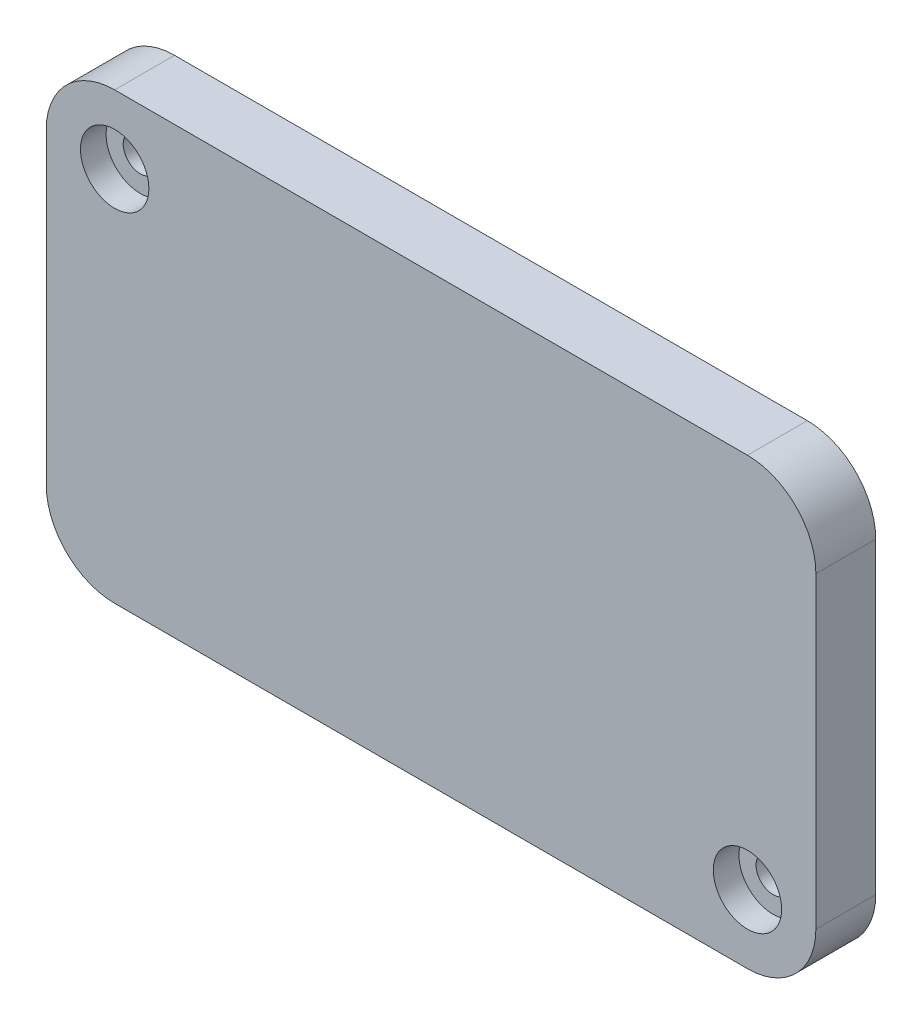
ISO-10303-21;
HEADER;
FILE_DESCRIPTION(('STEP AP214'),'2;1');
FILE_NAME('part.step','',(''),(''),'','','');
FILE_SCHEMA(('AUTOMOTIVE_DESIGN { 1 0 10303 214 1 1 1 1 }'));
ENDSEC;
DATA;
#1=APPLICATION_CONTEXT('core data for automotive mechanical design processes');
#2=APPLICATION_PROTOCOL_DEFINITION('international standard','automotive_design',2000,#1);
#3=PRODUCT_CONTEXT('',#1,'mechanical');
#4=PRODUCT('Part','Part','',(#3));
#5=PRODUCT_RELATED_PRODUCT_CATEGORY('part','',(#4));
#6=PRODUCT_DEFINITION_FORMATION('','',#4);
#7=PRODUCT_DEFINITION_CONTEXT('part definition',#1,'design');
#8=PRODUCT_DEFINITION('design','',#6,#7);
#9=PRODUCT_DEFINITION_SHAPE('','',#8);
#10=(LENGTH_UNIT() NAMED_UNIT(*) SI_UNIT(.MILLI.,.METRE.));
#11=(NAMED_UNIT(*) PLANE_ANGLE_UNIT() SI_UNIT($,.RADIAN.));
#12=(NAMED_UNIT(*) SI_UNIT($,.STERADIAN.) SOLID_ANGLE_UNIT());
#13=UNCERTAINTY_MEASURE_WITH_UNIT(LENGTH_MEASURE(1.E-05),#10,'distance_accuracy_value','');
#14=(GEOMETRIC_REPRESENTATION_CONTEXT(3) GLOBAL_UNCERTAINTY_ASSIGNED_CONTEXT((#13)) GLOBAL_UNIT_ASSIGNED_CONTEXT((#10,
#11,#12)) REPRESENTATION_CONTEXT('',''));
#15=CARTESIAN_POINT('',(0.,0.,0.));
#16=DIRECTION('',(0.,0.,1.));
#17=DIRECTION('',(1.,0.,0.));
#18=AXIS2_PLACEMENT_3D('',#15,#16,#17);
#19=CARTESIAN_POINT('',(0.,0.,3.5));
#20=DIRECTION('',(0.,0.,-1.));
#21=DIRECTION('',(-1.,0.,0.));
#22=AXIS2_PLACEMENT_3D('',#19,#20,#21);
#23=CYLINDRICAL_SURFACE('',#22,1.);
#24=CARTESIAN_POINT('',(0.,0.,0.));
#25=DIRECTION('',(0.,0.,1.));
#26=DIRECTION('',(1.,0.,0.));
#27=AXIS2_PLACEMENT_3D('',#24,#25,#26);
#28=CIRCLE('',#27,1.);
#29=CARTESIAN_POINT('',(1.,0.,0.));
#30=VERTEX_POINT('',#29);
#31=EDGE_CURVE('E130',#30,#30,#28,.T.);
#32=ORIENTED_EDGE('',*,*,#31,.F.);
#33=EDGE_LOOP('',(#32));
#34=FACE_BOUND('',#33,.T.);
#35=CARTESIAN_POINT('',(0.,0.,2.));
#36=DIRECTION('',(0.,0.,1.));
#37=DIRECTION('',(1.,0.,0.));
#38=AXIS2_PLACEMENT_3D('',#35,#36,#37);
#39=CIRCLE('',#38,1.);
#40=CARTESIAN_POINT('',(1.,0.,2.));
#41=VERTEX_POINT('',#40);
#42=EDGE_CURVE('E38',#41,#41,#39,.T.);
#43=ORIENTED_EDGE('',*,*,#42,.T.);
#44=EDGE_LOOP('',(#43));
#45=FACE_BOUND('',#44,.T.);
#46=ADVANCED_FACE('F34',(#34,#45),#23,.F.);
#47=CARTESIAN_POINT('',(37.,-18.,3.5));
#48=DIRECTION('',(0.,0.,-1.));
#49=DIRECTION('',(-1.,0.,0.));
#50=AXIS2_PLACEMENT_3D('',#47,#48,#49);
#51=CYLINDRICAL_SURFACE('',#50,0.999999999999998);
#52=CARTESIAN_POINT('',(37.,-18.,0.));
#53=DIRECTION('',(0.,0.,1.));
#54=DIRECTION('',(1.,0.,0.));
#55=AXIS2_PLACEMENT_3D('',#52,#53,#54);
#56=CIRCLE('',#55,0.999999999999998);
#57=CARTESIAN_POINT('',(38.,-18.,0.));
#58=VERTEX_POINT('',#57);
#59=EDGE_CURVE('E136',#58,#58,#56,.T.);
#60=ORIENTED_EDGE('',*,*,#59,.F.);
#61=EDGE_LOOP('',(#60));
#62=FACE_BOUND('',#61,.T.);
#63=CARTESIAN_POINT('',(37.,-18.,2.));
#64=DIRECTION('',(0.,0.,1.));
#65=DIRECTION('',(1.,0.,0.));
#66=AXIS2_PLACEMENT_3D('',#63,#64,#65);
#67=CIRCLE('',#66,0.999999999999998);
#68=CARTESIAN_POINT('',(38.,-18.,2.));
#69=VERTEX_POINT('',#68);
#70=EDGE_CURVE('E165',#69,#69,#67,.T.);
#71=ORIENTED_EDGE('',*,*,#70,.T.);
#72=EDGE_LOOP('',(#71));
#73=FACE_BOUND('',#72,.T.);
#74=ADVANCED_FACE('F219',(#62,#73),#51,.F.);
#75=CARTESIAN_POINT('',(0.,0.,3.5));
#76=DIRECTION('',(0.,0.,1.));
#77=DIRECTION('',(1.,0.,0.));
#78=AXIS2_PLACEMENT_3D('',#75,#76,#77);
#79=PLANE('',#78);
#80=CARTESIAN_POINT('',(37.,-18.,3.5));
#81=DIRECTION('',(0.,0.,1.));
#82=DIRECTION('',(1.,0.,0.));
#83=AXIS2_PLACEMENT_3D('',#80,#81,#82);
#84=CIRCLE('',#83,2.);
#85=CARTESIAN_POINT('',(39.,-18.,3.5));
#86=VERTEX_POINT('',#85);
#87=EDGE_CURVE('E172',#86,#86,#84,.T.);
#88=ORIENTED_EDGE('',*,*,#87,.F.);
#89=EDGE_LOOP('',(#88));
#90=FACE_BOUND('',#89,.T.);
#91=CARTESIAN_POINT('',(0.,0.,3.5));
#92=DIRECTION('',(0.,0.,1.));
#93=DIRECTION('',(1.,0.,0.));
#94=AXIS2_PLACEMENT_3D('',#91,#92,#93);
#95=CIRCLE('',#94,2.);
#96=CARTESIAN_POINT('',(2.,0.,3.5));
#97=VERTEX_POINT('',#96);
#98=EDGE_CURVE('E182',#97,#97,#95,.T.);
#99=ORIENTED_EDGE('',*,*,#98,.F.);
#100=EDGE_LOOP('',(#99));
#101=FACE_BOUND('',#100,.T.);
#102=DIRECTION('',(-1.,0.,0.));
#103=VECTOR('',#102,1.);
#104=CARTESIAN_POINT('',(-4.,4.,3.5));
#105=LINE('',#104,#103);
#106=CARTESIAN_POINT('',(37.,4.,3.5));
#107=VERTEX_POINT('',#106);
#108=CARTESIAN_POINT('',(0.,4.,3.5));
#109=VERTEX_POINT('',#108);
#110=EDGE_CURVE('E139',#107,#109,#105,.T.);
#111=ORIENTED_EDGE('',*,*,#110,.T.);
#112=CARTESIAN_POINT('',(0.,0.,3.5));
#113=DIRECTION('',(0.,0.,1.));
#114=DIRECTION('',(1.,0.,0.));
#115=AXIS2_PLACEMENT_3D('',#112,#113,#114);
#116=CIRCLE('',#115,4.);
#117=CARTESIAN_POINT('',(-4.,0.,3.5));
#118=VERTEX_POINT('',#117);
#119=EDGE_CURVE('E158',#109,#118,#116,.T.);
#120=ORIENTED_EDGE('',*,*,#119,.T.);
#121=DIRECTION('',(0.,-1.,0.));
#122=VECTOR('',#121,1.);
#123=CARTESIAN_POINT('',(-4.,4.,3.5));
#124=LINE('',#123,#122);
#125=CARTESIAN_POINT('',(-4.,-18.,3.5));
#126=VERTEX_POINT('',#125);
#127=EDGE_CURVE('E122',#118,#126,#124,.T.);
#128=ORIENTED_EDGE('',*,*,#127,.T.);
#129=CARTESIAN_POINT('',(0.,-18.,3.5));
#130=DIRECTION('',(0.,0.,1.));
#131=DIRECTION('',(1.,0.,0.));
#132=AXIS2_PLACEMENT_3D('',#129,#130,#131);
#133=CIRCLE('',#132,4.);
#134=CARTESIAN_POINT('',(0.,-22.,3.5));
#135=VERTEX_POINT('',#134);
#136=EDGE_CURVE('E156',#126,#135,#133,.T.);
#137=ORIENTED_EDGE('',*,*,#136,.T.);
#138=DIRECTION('',(1.,0.,0.));
#139=VECTOR('',#138,1.);
#140=CARTESIAN_POINT('',(-4.,-22.,3.5));
#141=LINE('',#140,#139);
#142=CARTESIAN_POINT('',(37.,-22.,3.5));
#143=VERTEX_POINT('',#142);
#144=EDGE_CURVE('E188',#135,#143,#141,.T.);
#145=ORIENTED_EDGE('',*,*,#144,.T.);
#146=CARTESIAN_POINT('',(37.,-18.,3.5));
#147=DIRECTION('',(0.,0.,1.));
#148=DIRECTION('',(1.,0.,0.));
#149=AXIS2_PLACEMENT_3D('',#146,#147,#148);
#150=CIRCLE('',#149,4.);
#151=CARTESIAN_POINT('',(41.,-18.,3.5));
#152=VERTEX_POINT('',#151);
#153=EDGE_CURVE('E57',#143,#152,#150,.T.);
#154=ORIENTED_EDGE('',*,*,#153,.T.);
#155=DIRECTION('',(0.,1.,0.));
#156=VECTOR('',#155,1.);
#157=CARTESIAN_POINT('',(41.,4.,3.5));
#158=LINE('',#157,#156);
#159=CARTESIAN_POINT('',(41.,0.,3.5));
#160=VERTEX_POINT('',#159);
#161=EDGE_CURVE('E189',#152,#160,#158,.T.);
#162=ORIENTED_EDGE('',*,*,#161,.T.);
#163=CARTESIAN_POINT('',(37.,0.,3.5));
#164=DIRECTION('',(0.,0.,1.));
#165=DIRECTION('',(1.,0.,0.));
#166=AXIS2_PLACEMENT_3D('',#163,#164,#165);
#167=CIRCLE('',#166,4.);
#168=EDGE_CURVE('E153',#160,#107,#167,.T.);
#169=ORIENTED_EDGE('',*,*,#168,.T.);
#170=EDGE_LOOP('',(#111,#120,#128,#137,#145,#154,#162,#169));
#171=FACE_BOUND('',#170,.T.);
#172=ADVANCED_FACE('F193',(#90,#101,#171),#79,.T.);
#173=CARTESIAN_POINT('',(0.,0.,0.));
#174=DIRECTION('',(0.,0.,1.));
#175=DIRECTION('',(1.,0.,0.));
#176=AXIS2_PLACEMENT_3D('',#173,#174,#175);
#177=PLANE('',#176);
#178=DIRECTION('',(0.,-1.,0.));
#179=VECTOR('',#178,1.);
#180=CARTESIAN_POINT('',(-4.,4.,0.));
#181=LINE('',#180,#179);
#182=CARTESIAN_POINT('',(-4.,0.,0.));
#183=VERTEX_POINT('',#182);
#184=CARTESIAN_POINT('',(-4.,-18.,0.));
#185=VERTEX_POINT('',#184);
#186=EDGE_CURVE('E119',#183,#185,#181,.T.);
#187=ORIENTED_EDGE('',*,*,#186,.F.);
#188=CARTESIAN_POINT('',(0.,0.,0.));
#189=DIRECTION('',(0.,0.,1.));
#190=DIRECTION('',(1.,0.,0.));
#191=AXIS2_PLACEMENT_3D('',#188,#189,#190);
#192=CIRCLE('',#191,4.);
#193=CARTESIAN_POINT('',(0.,4.,0.));
#194=VERTEX_POINT('',#193);
#195=EDGE_CURVE('E102',#183,#194,#192,.F.);
#196=ORIENTED_EDGE('',*,*,#195,.T.);
#197=DIRECTION('',(-1.,0.,0.));
#198=VECTOR('',#197,1.);
#199=CARTESIAN_POINT('',(-4.,4.,0.));
#200=LINE('',#199,#198);
#201=CARTESIAN_POINT('',(37.,4.,0.));
#202=VERTEX_POINT('',#201);
#203=EDGE_CURVE('E143',#202,#194,#200,.T.);
#204=ORIENTED_EDGE('',*,*,#203,.F.);
#205=CARTESIAN_POINT('',(37.,0.,0.));
#206=DIRECTION('',(0.,0.,1.));
#207=DIRECTION('',(1.,0.,0.));
#208=AXIS2_PLACEMENT_3D('',#205,#206,#207);
#209=CIRCLE('',#208,4.);
#210=CARTESIAN_POINT('',(41.,0.,0.));
#211=VERTEX_POINT('',#210);
#212=EDGE_CURVE('E123',#202,#211,#209,.F.);
#213=ORIENTED_EDGE('',*,*,#212,.T.);
#214=DIRECTION('',(0.,1.,0.));
#215=VECTOR('',#214,1.);
#216=CARTESIAN_POINT('',(41.,4.,0.));
#217=LINE('',#216,#215);
#218=CARTESIAN_POINT('',(41.,-18.,0.));
#219=VERTEX_POINT('',#218);
#220=EDGE_CURVE('E133',#219,#211,#217,.T.);
#221=ORIENTED_EDGE('',*,*,#220,.F.);
#222=CARTESIAN_POINT('',(37.,-18.,0.));
#223=DIRECTION('',(0.,0.,1.));
#224=DIRECTION('',(1.,0.,0.));
#225=AXIS2_PLACEMENT_3D('',#222,#223,#224);
#226=CIRCLE('',#225,4.);
#227=CARTESIAN_POINT('',(37.,-22.,0.));
#228=VERTEX_POINT('',#227);
#229=EDGE_CURVE('E147',#219,#228,#226,.F.);
#230=ORIENTED_EDGE('',*,*,#229,.T.);
#231=DIRECTION('',(1.,0.,0.));
#232=VECTOR('',#231,1.);
#233=CARTESIAN_POINT('',(-4.,-22.,0.));
#234=LINE('',#233,#232);
#235=CARTESIAN_POINT('',(0.,-22.,0.));
#236=VERTEX_POINT('',#235);
#237=EDGE_CURVE('E129',#236,#228,#234,.T.);
#238=ORIENTED_EDGE('',*,*,#237,.F.);
#239=CARTESIAN_POINT('',(0.,-18.,0.));
#240=DIRECTION('',(0.,0.,1.));
#241=DIRECTION('',(1.,0.,0.));
#242=AXIS2_PLACEMENT_3D('',#239,#240,#241);
#243=CIRCLE('',#242,4.);
#244=EDGE_CURVE('E113',#236,#185,#243,.F.);
#245=ORIENTED_EDGE('',*,*,#244,.T.);
#246=EDGE_LOOP('',(#187,#196,#204,#213,#221,#230,#238,#245));
#247=FACE_BOUND('',#246,.T.);
#248=ORIENTED_EDGE('',*,*,#31,.T.);
#249=EDGE_LOOP('',(#248));
#250=FACE_BOUND('',#249,.T.);
#251=ORIENTED_EDGE('',*,*,#59,.T.);
#252=EDGE_LOOP('',(#251));
#253=FACE_BOUND('',#252,.T.);
#254=ADVANCED_FACE('F126',(#247,#250,#253),#177,.F.);
#255=CARTESIAN_POINT('',(-4.,4.,3.5));
#256=DIRECTION('',(1.,0.,0.));
#257=DIRECTION('',(0.,1.,0.));
#258=AXIS2_PLACEMENT_3D('',#255,#256,#257);
#259=PLANE('',#258);
#260=ORIENTED_EDGE('',*,*,#127,.F.);
#261=DIRECTION('',(0.,0.,-1.));
#262=VECTOR('',#261,1.);
#263=CARTESIAN_POINT('',(-4.,0.,3.5));
#264=LINE('',#263,#262);
#265=EDGE_CURVE('E106',#118,#183,#264,.T.);
#266=ORIENTED_EDGE('',*,*,#265,.T.);
#267=ORIENTED_EDGE('',*,*,#186,.T.);
#268=DIRECTION('',(0.,0.,-1.));
#269=VECTOR('',#268,1.);
#270=CARTESIAN_POINT('',(-4.,-18.,3.5));
#271=LINE('',#270,#269);
#272=EDGE_CURVE('E124',#185,#126,#271,.F.);
#273=ORIENTED_EDGE('',*,*,#272,.T.);
#274=EDGE_LOOP('',(#260,#266,#267,#273));
#275=FACE_BOUND('',#274,.T.);
#276=ADVANCED_FACE('F118',(#275),#259,.F.);
#277=CARTESIAN_POINT('',(-4.,-22.,3.5));
#278=DIRECTION('',(0.,1.,0.));
#279=DIRECTION('',(0.,0.,1.));
#280=AXIS2_PLACEMENT_3D('',#277,#278,#279);
#281=PLANE('',#280);
#282=ORIENTED_EDGE('',*,*,#144,.F.);
#283=DIRECTION('',(0.,0.,-1.));
#284=VECTOR('',#283,1.);
#285=CARTESIAN_POINT('',(0.,-22.,3.5));
#286=LINE('',#285,#284);
#287=EDGE_CURVE('E162',#135,#236,#286,.T.);
#288=ORIENTED_EDGE('',*,*,#287,.T.);
#289=ORIENTED_EDGE('',*,*,#237,.T.);
#290=DIRECTION('',(0.,0.,-1.));
#291=VECTOR('',#290,1.);
#292=CARTESIAN_POINT('',(37.,-22.,3.5));
#293=LINE('',#292,#291);
#294=EDGE_CURVE('E160',#228,#143,#293,.F.);
#295=ORIENTED_EDGE('',*,*,#294,.T.);
#296=EDGE_LOOP('',(#282,#288,#289,#295));
#297=FACE_BOUND('',#296,.T.);
#298=ADVANCED_FACE('F206',(#297),#281,.F.);
#299=CARTESIAN_POINT('',(41.,4.,3.5));
#300=DIRECTION('',(-1.,0.,0.));
#301=DIRECTION('',(0.,0.,1.));
#302=AXIS2_PLACEMENT_3D('',#299,#300,#301);
#303=PLANE('',#302);
#304=ORIENTED_EDGE('',*,*,#161,.F.);
#305=DIRECTION('',(0.,0.,-1.));
#306=VECTOR('',#305,1.);
#307=CARTESIAN_POINT('',(41.,-18.,3.5));
#308=LINE('',#307,#306);
#309=EDGE_CURVE('E11',#152,#219,#308,.T.);
#310=ORIENTED_EDGE('',*,*,#309,.T.);
#311=ORIENTED_EDGE('',*,*,#220,.T.);
#312=DIRECTION('',(0.,0.,-1.));
#313=VECTOR('',#312,1.);
#314=CARTESIAN_POINT('',(41.,0.,3.5));
#315=LINE('',#314,#313);
#316=EDGE_CURVE('E43',#211,#160,#315,.F.);
#317=ORIENTED_EDGE('',*,*,#316,.T.);
#318=EDGE_LOOP('',(#304,#310,#311,#317));
#319=FACE_BOUND('',#318,.T.);
#320=ADVANCED_FACE('F199',(#319),#303,.F.);
#321=CARTESIAN_POINT('',(-4.,4.,3.5));
#322=DIRECTION('',(0.,-1.,0.));
#323=DIRECTION('',(0.,0.,-1.));
#324=AXIS2_PLACEMENT_3D('',#321,#322,#323);
#325=PLANE('',#324);
#326=ORIENTED_EDGE('',*,*,#203,.T.);
#327=DIRECTION('',(0.,0.,-1.));
#328=VECTOR('',#327,1.);
#329=CARTESIAN_POINT('',(0.,4.,3.5));
#330=LINE('',#329,#328);
#331=EDGE_CURVE('E107',#194,#109,#330,.F.);
#332=ORIENTED_EDGE('',*,*,#331,.T.);
#333=ORIENTED_EDGE('',*,*,#110,.F.);
#334=DIRECTION('',(0.,0.,-1.));
#335=VECTOR('',#334,1.);
#336=CARTESIAN_POINT('',(37.,4.,3.5));
#337=LINE('',#336,#335);
#338=EDGE_CURVE('E112',#107,#202,#337,.T.);
#339=ORIENTED_EDGE('',*,*,#338,.T.);
#340=EDGE_LOOP('',(#326,#332,#333,#339));
#341=FACE_BOUND('',#340,.T.);
#342=ADVANCED_FACE('F196',(#341),#325,.F.);
#343=CARTESIAN_POINT('',(0.,0.,3.5));
#344=DIRECTION('',(0.,0.,-1.));
#345=DIRECTION('',(-1.,0.,0.));
#346=AXIS2_PLACEMENT_3D('',#343,#344,#345);
#347=CYLINDRICAL_SURFACE('',#346,4.);
#348=ORIENTED_EDGE('',*,*,#119,.F.);
#349=ORIENTED_EDGE('',*,*,#331,.F.);
#350=ORIENTED_EDGE('',*,*,#195,.F.);
#351=ORIENTED_EDGE('',*,*,#265,.F.);
#352=EDGE_LOOP('',(#348,#349,#350,#351));
#353=FACE_BOUND('',#352,.T.);
#354=ADVANCED_FACE('F105',(#353),#347,.T.);
#355=CARTESIAN_POINT('',(0.,-18.,3.5));
#356=DIRECTION('',(0.,0.,-1.));
#357=DIRECTION('',(-1.,0.,0.));
#358=AXIS2_PLACEMENT_3D('',#355,#356,#357);
#359=CYLINDRICAL_SURFACE('',#358,4.);
#360=ORIENTED_EDGE('',*,*,#136,.F.);
#361=ORIENTED_EDGE('',*,*,#272,.F.);
#362=ORIENTED_EDGE('',*,*,#244,.F.);
#363=ORIENTED_EDGE('',*,*,#287,.F.);
#364=EDGE_LOOP('',(#360,#361,#362,#363));
#365=FACE_BOUND('',#364,.T.);
#366=ADVANCED_FACE('F210',(#365),#359,.T.);
#367=CARTESIAN_POINT('',(37.,-18.,3.5));
#368=DIRECTION('',(0.,0.,-1.));
#369=DIRECTION('',(-1.,0.,0.));
#370=AXIS2_PLACEMENT_3D('',#367,#368,#369);
#371=CYLINDRICAL_SURFACE('',#370,4.);
#372=ORIENTED_EDGE('',*,*,#153,.F.);
#373=ORIENTED_EDGE('',*,*,#294,.F.);
#374=ORIENTED_EDGE('',*,*,#229,.F.);
#375=ORIENTED_EDGE('',*,*,#309,.F.);
#376=EDGE_LOOP('',(#372,#373,#374,#375));
#377=FACE_BOUND('',#376,.T.);
#378=ADVANCED_FACE('F202',(#377),#371,.T.);
#379=CARTESIAN_POINT('',(37.,0.,3.5));
#380=DIRECTION('',(0.,0.,-1.));
#381=DIRECTION('',(-1.,0.,0.));
#382=AXIS2_PLACEMENT_3D('',#379,#380,#381);
#383=CYLINDRICAL_SURFACE('',#382,4.);
#384=ORIENTED_EDGE('',*,*,#168,.F.);
#385=ORIENTED_EDGE('',*,*,#316,.F.);
#386=ORIENTED_EDGE('',*,*,#212,.F.);
#387=ORIENTED_EDGE('',*,*,#338,.F.);
#388=EDGE_LOOP('',(#384,#385,#386,#387));
#389=FACE_BOUND('',#388,.T.);
#390=ADVANCED_FACE('F36',(#389),#383,.T.);
#391=CARTESIAN_POINT('',(37.,-18.,2.));
#392=DIRECTION('',(0.,0.,1.));
#393=DIRECTION('',(1.,0.,0.));
#394=AXIS2_PLACEMENT_3D('',#391,#392,#393);
#395=CYLINDRICAL_SURFACE('',#394,2.);
#396=CARTESIAN_POINT('',(37.,-18.,2.));
#397=DIRECTION('',(0.,0.,1.));
#398=DIRECTION('',(1.,0.,0.));
#399=AXIS2_PLACEMENT_3D('',#396,#397,#398);
#400=CIRCLE('',#399,2.);
#401=CARTESIAN_POINT('',(39.,-18.,2.));
#402=VERTEX_POINT('',#401);
#403=EDGE_CURVE('E167',#402,#402,#400,.T.);
#404=ORIENTED_EDGE('',*,*,#403,.F.);
#405=EDGE_LOOP('',(#404));
#406=FACE_BOUND('',#405,.T.);
#407=ORIENTED_EDGE('',*,*,#87,.T.);
#408=EDGE_LOOP('',(#407));
#409=FACE_BOUND('',#408,.T.);
#410=ADVANCED_FACE('F281',(#406,#409),#395,.F.);
#411=CARTESIAN_POINT('',(37.,-18.,2.));
#412=DIRECTION('',(0.,0.,1.));
#413=DIRECTION('',(1.,0.,0.));
#414=AXIS2_PLACEMENT_3D('',#411,#412,#413);
#415=PLANE('',#414);
#416=ORIENTED_EDGE('',*,*,#70,.F.);
#417=EDGE_LOOP('',(#416));
#418=FACE_BOUND('',#417,.T.);
#419=ORIENTED_EDGE('',*,*,#403,.T.);
#420=EDGE_LOOP('',(#419));
#421=FACE_BOUND('',#420,.T.);
#422=ADVANCED_FACE('F307',(#418,#421),#415,.T.);
#423=CARTESIAN_POINT('',(0.,0.,2.));
#424=DIRECTION('',(0.,0.,1.));
#425=DIRECTION('',(1.,0.,0.));
#426=AXIS2_PLACEMENT_3D('',#423,#424,#425);
#427=CYLINDRICAL_SURFACE('',#426,2.);
#428=CARTESIAN_POINT('',(0.,0.,2.));
#429=DIRECTION('',(0.,0.,1.));
#430=DIRECTION('',(1.,0.,0.));
#431=AXIS2_PLACEMENT_3D('',#428,#429,#430);
#432=CIRCLE('',#431,2.);
#433=CARTESIAN_POINT('',(2.,0.,2.));
#434=VERTEX_POINT('',#433);
#435=EDGE_CURVE('E177',#434,#434,#432,.T.);
#436=ORIENTED_EDGE('',*,*,#435,.F.);
#437=EDGE_LOOP('',(#436));
#438=FACE_BOUND('',#437,.T.);
#439=ORIENTED_EDGE('',*,*,#98,.T.);
#440=EDGE_LOOP('',(#439));
#441=FACE_BOUND('',#440,.T.);
#442=ADVANCED_FACE('F317',(#438,#441),#427,.F.);
#443=CARTESIAN_POINT('',(0.,0.,2.));
#444=DIRECTION('',(0.,0.,1.));
#445=DIRECTION('',(1.,0.,0.));
#446=AXIS2_PLACEMENT_3D('',#443,#444,#445);
#447=PLANE('',#446);
#448=ORIENTED_EDGE('',*,*,#42,.F.);
#449=EDGE_LOOP('',(#448));
#450=FACE_BOUND('',#449,.T.);
#451=ORIENTED_EDGE('',*,*,#435,.T.);
#452=EDGE_LOOP('',(#451));
#453=FACE_BOUND('',#452,.T.);
#454=ADVANCED_FACE('F327',(#450,#453),#447,.T.);
#455=CLOSED_SHELL('',(#46,#74,#172,#254,#276,#298,#320,#342,#354,#366,#378,#390,#410,#422,#442,#454));
#456=MANIFOLD_SOLID_BREP('B2',#455);
#457=ADVANCED_BREP_SHAPE_REPRESENTATION('',(#18,#456),#14);
#458=SHAPE_DEFINITION_REPRESENTATION(#9,#457);
ENDSEC;
END-ISO-10303-21;
